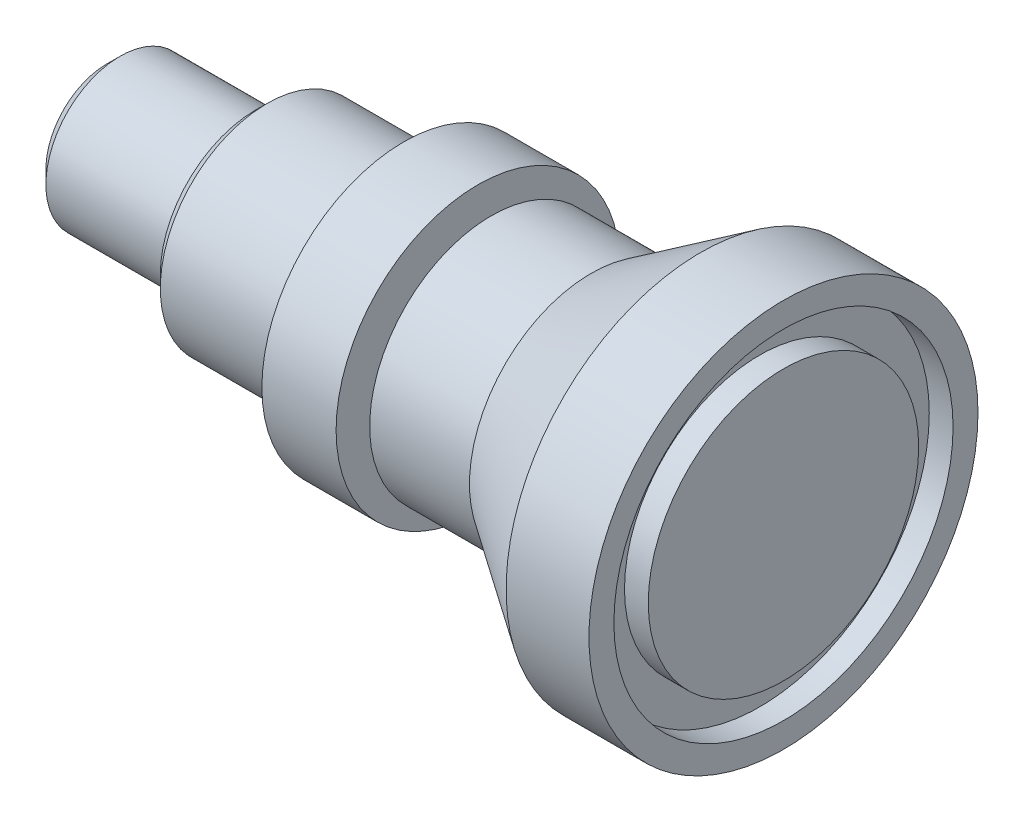
ISO-10303-21;
HEADER;
FILE_DESCRIPTION(('STEP AP214'),'2;1');
FILE_NAME('part.step','',(''),(''),'','','');
FILE_SCHEMA(('AUTOMOTIVE_DESIGN { 1 0 10303 214 1 1 1 1 }'));
ENDSEC;
DATA;
#1=APPLICATION_CONTEXT('core data for automotive mechanical design processes');
#2=APPLICATION_PROTOCOL_DEFINITION('international standard','automotive_design',2000,#1);
#3=PRODUCT_CONTEXT('',#1,'mechanical');
#4=PRODUCT('Part','Part','',(#3));
#5=PRODUCT_RELATED_PRODUCT_CATEGORY('part','',(#4));
#6=PRODUCT_DEFINITION_FORMATION('','',#4);
#7=PRODUCT_DEFINITION_CONTEXT('part definition',#1,'design');
#8=PRODUCT_DEFINITION('design','',#6,#7);
#9=PRODUCT_DEFINITION_SHAPE('','',#8);
#10=(LENGTH_UNIT() NAMED_UNIT(*) SI_UNIT(.MILLI.,.METRE.));
#11=(NAMED_UNIT(*) PLANE_ANGLE_UNIT() SI_UNIT($,.RADIAN.));
#12=(NAMED_UNIT(*) SI_UNIT($,.STERADIAN.) SOLID_ANGLE_UNIT());
#13=UNCERTAINTY_MEASURE_WITH_UNIT(LENGTH_MEASURE(1.E-05),#10,'distance_accuracy_value','');
#14=(GEOMETRIC_REPRESENTATION_CONTEXT(3) GLOBAL_UNCERTAINTY_ASSIGNED_CONTEXT((#13)) GLOBAL_UNIT_ASSIGNED_CONTEXT((#10,
#11,#12)) REPRESENTATION_CONTEXT('',''));
#15=CARTESIAN_POINT('',(0.,0.,0.));
#16=DIRECTION('',(0.,0.,1.));
#17=DIRECTION('',(1.,0.,0.));
#18=AXIS2_PLACEMENT_3D('',#15,#16,#17);
#19=CARTESIAN_POINT('',(0.,0.,0.));
#20=DIRECTION('',(-1.,0.,0.));
#21=DIRECTION('',(0.,0.,1.));
#22=AXIS2_PLACEMENT_3D('',#19,#20,#21);
#23=PLANE('',#22);
#24=CARTESIAN_POINT('',(0.,0.,0.));
#25=DIRECTION('',(1.,0.,0.));
#26=DIRECTION('',(0.,0.,-1.));
#27=AXIS2_PLACEMENT_3D('',#24,#25,#26);
#28=CIRCLE('',#27,2.60981675392669);
#29=CARTESIAN_POINT('',(0.,0.,-2.60981675392669));
#30=VERTEX_POINT('',#29);
#31=EDGE_CURVE('E10',#30,#30,#28,.T.);
#32=ORIENTED_EDGE('',*,*,#31,.F.);
#33=EDGE_LOOP('',(#32));
#34=FACE_BOUND('',#33,.T.);
#35=ADVANCED_FACE('F34',(#34),#23,.T.);
#36=CARTESIAN_POINT('',(0.565183246073291,0.,0.));
#37=DIRECTION('',(1.,0.,0.));
#38=DIRECTION('',(0.,0.,-1.));
#39=AXIS2_PLACEMENT_3D('',#36,#37,#38);
#40=CONICAL_SURFACE('',#39,3.175,0.785398163397462);
#41=ORIENTED_EDGE('',*,*,#31,.T.);
#42=EDGE_LOOP('',(#41));
#43=FACE_BOUND('',#42,.T.);
#44=CARTESIAN_POINT('',(0.565183246073291,0.,0.));
#45=DIRECTION('',(1.,0.,0.));
#46=DIRECTION('',(0.,0.,-1.));
#47=AXIS2_PLACEMENT_3D('',#44,#45,#46);
#48=CIRCLE('',#47,3.175);
#49=CARTESIAN_POINT('',(0.565183246073291,0.,-3.175));
#50=VERTEX_POINT('',#49);
#51=EDGE_CURVE('E40',#50,#50,#48,.T.);
#52=ORIENTED_EDGE('',*,*,#51,.F.);
#53=EDGE_LOOP('',(#52));
#54=FACE_BOUND('',#53,.T.);
#55=ADVANCED_FACE('F112',(#43,#54),#40,.T.);
#56=CARTESIAN_POINT('',(28.9459503845607,0.,0.));
#57=DIRECTION('',(1.,0.,0.));
#58=DIRECTION('',(0.,0.,-1.));
#59=AXIS2_PLACEMENT_3D('',#56,#57,#58);
#60=CYLINDRICAL_SURFACE('',#59,3.175);
#61=ORIENTED_EDGE('',*,*,#51,.T.);
#62=EDGE_LOOP('',(#61));
#63=FACE_BOUND('',#62,.T.);
#64=CARTESIAN_POINT('',(6.35,0.,0.));
#65=DIRECTION('',(1.,0.,0.));
#66=DIRECTION('',(0.,0.,-1.));
#67=AXIS2_PLACEMENT_3D('',#64,#65,#66);
#68=CIRCLE('',#67,3.175);
#69=CARTESIAN_POINT('',(6.35,0.,-3.175));
#70=VERTEX_POINT('',#69);
#71=EDGE_CURVE('E44',#70,#70,#68,.T.);
#72=ORIENTED_EDGE('',*,*,#71,.F.);
#73=EDGE_LOOP('',(#72));
#74=FACE_BOUND('',#73,.T.);
#75=ADVANCED_FACE('F117',(#63,#74),#60,.T.);
#76=CARTESIAN_POINT('',(6.35,3.175,0.));
#77=DIRECTION('',(-1.,0.,0.));
#78=DIRECTION('',(0.,0.,1.));
#79=AXIS2_PLACEMENT_3D('',#76,#77,#78);
#80=PLANE('',#79);
#81=ORIENTED_EDGE('',*,*,#71,.T.);
#82=EDGE_LOOP('',(#81));
#83=FACE_BOUND('',#82,.T.);
#84=CARTESIAN_POINT('',(6.35,0.,0.));
#85=DIRECTION('',(1.,0.,0.));
#86=DIRECTION('',(0.,0.,-1.));
#87=AXIS2_PLACEMENT_3D('',#84,#85,#86);
#88=CIRCLE('',#87,4.0658639837183);
#89=CARTESIAN_POINT('',(6.35,0.,-4.0658639837183));
#90=VERTEX_POINT('',#89);
#91=EDGE_CURVE('E48',#90,#90,#88,.T.);
#92=ORIENTED_EDGE('',*,*,#91,.F.);
#93=EDGE_LOOP('',(#92));
#94=FACE_BOUND('',#93,.T.);
#95=ADVANCED_FACE('F121',(#83,#94),#80,.T.);
#96=CARTESIAN_POINT('',(6.85613601628168,0.,0.));
#97=DIRECTION('',(1.,0.,0.));
#98=DIRECTION('',(0.,0.,-1.));
#99=AXIS2_PLACEMENT_3D('',#96,#97,#98);
#100=CONICAL_SURFACE('',#99,4.572,0.785398163397459);
#101=ORIENTED_EDGE('',*,*,#91,.T.);
#102=EDGE_LOOP('',(#101));
#103=FACE_BOUND('',#102,.T.);
#104=CARTESIAN_POINT('',(6.85613601628168,0.,0.));
#105=DIRECTION('',(1.,0.,0.));
#106=DIRECTION('',(0.,0.,-1.));
#107=AXIS2_PLACEMENT_3D('',#104,#105,#106);
#108=CIRCLE('',#107,4.572);
#109=CARTESIAN_POINT('',(6.85613601628168,0.,-4.572));
#110=VERTEX_POINT('',#109);
#111=EDGE_CURVE('E53',#110,#110,#108,.T.);
#112=ORIENTED_EDGE('',*,*,#111,.F.);
#113=EDGE_LOOP('',(#112));
#114=FACE_BOUND('',#113,.T.);
#115=ADVANCED_FACE('F127',(#103,#114),#100,.T.);
#116=CARTESIAN_POINT('',(28.9459503845607,0.,0.));
#117=DIRECTION('',(1.,0.,0.));
#118=DIRECTION('',(0.,0.,-1.));
#119=AXIS2_PLACEMENT_3D('',#116,#117,#118);
#120=CYLINDRICAL_SURFACE('',#119,4.572);
#121=ORIENTED_EDGE('',*,*,#111,.T.);
#122=EDGE_LOOP('',(#121));
#123=FACE_BOUND('',#122,.T.);
#124=CARTESIAN_POINT('',(12.7,0.,0.));
#125=DIRECTION('',(1.,0.,0.));
#126=DIRECTION('',(0.,0.,-1.));
#127=AXIS2_PLACEMENT_3D('',#124,#125,#126);
#128=CIRCLE('',#127,4.572);
#129=CARTESIAN_POINT('',(12.7,0.,-4.572));
#130=VERTEX_POINT('',#129);
#131=EDGE_CURVE('E56',#130,#130,#128,.T.);
#132=ORIENTED_EDGE('',*,*,#131,.F.);
#133=EDGE_LOOP('',(#132));
#134=FACE_BOUND('',#133,.T.);
#135=ADVANCED_FACE('F131',(#123,#134),#120,.T.);
#136=CARTESIAN_POINT('',(12.7,4.572,0.));
#137=DIRECTION('',(-1.,0.,0.));
#138=DIRECTION('',(0.,0.,1.));
#139=AXIS2_PLACEMENT_3D('',#136,#137,#138);
#140=PLANE('',#139);
#141=ORIENTED_EDGE('',*,*,#131,.T.);
#142=EDGE_LOOP('',(#141));
#143=FACE_BOUND('',#142,.T.);
#144=CARTESIAN_POINT('',(12.7,0.,0.));
#145=DIRECTION('',(1.,0.,0.));
#146=DIRECTION('',(0.,0.,-1.));
#147=AXIS2_PLACEMENT_3D('',#144,#145,#146);
#148=CIRCLE('',#147,6.06906472114014);
#149=CARTESIAN_POINT('',(12.7,0.,-6.06906472114014));
#150=VERTEX_POINT('',#149);
#151=EDGE_CURVE('E59',#150,#150,#148,.T.);
#152=ORIENTED_EDGE('',*,*,#151,.F.);
#153=EDGE_LOOP('',(#152));
#154=FACE_BOUND('',#153,.T.);
#155=ADVANCED_FACE('F135',(#143,#154),#140,.T.);
#156=CARTESIAN_POINT('',(28.9459503845607,0.,0.));
#157=DIRECTION('',(1.,0.,0.));
#158=DIRECTION('',(0.,0.,-1.));
#159=AXIS2_PLACEMENT_3D('',#156,#157,#158);
#160=CYLINDRICAL_SURFACE('',#159,6.06906472114014);
#161=ORIENTED_EDGE('',*,*,#151,.T.);
#162=EDGE_LOOP('',(#161));
#163=FACE_BOUND('',#162,.T.);
#164=CARTESIAN_POINT('',(15.875,0.,0.));
#165=DIRECTION('',(1.,0.,0.));
#166=DIRECTION('',(0.,0.,-1.));
#167=AXIS2_PLACEMENT_3D('',#164,#165,#166);
#168=CIRCLE('',#167,6.06906472114013);
#169=CARTESIAN_POINT('',(15.875,0.,-6.06906472114013));
#170=VERTEX_POINT('',#169);
#171=EDGE_CURVE('E62',#170,#170,#168,.T.);
#172=ORIENTED_EDGE('',*,*,#171,.F.);
#173=EDGE_LOOP('',(#172));
#174=FACE_BOUND('',#173,.T.);
#175=ADVANCED_FACE('F139',(#163,#174),#160,.T.);
#176=CARTESIAN_POINT('',(15.875,6.06906472114013,0.));
#177=DIRECTION('',(1.,0.,0.));
#178=DIRECTION('',(0.,0.,-1.));
#179=AXIS2_PLACEMENT_3D('',#176,#177,#178);
#180=PLANE('',#179);
#181=ORIENTED_EDGE('',*,*,#171,.T.);
#182=EDGE_LOOP('',(#181));
#183=FACE_BOUND('',#182,.T.);
#184=CARTESIAN_POINT('',(15.875,0.,0.));
#185=DIRECTION('',(1.,0.,0.));
#186=DIRECTION('',(0.,0.,-1.));
#187=AXIS2_PLACEMENT_3D('',#184,#185,#186);
#188=CIRCLE('',#187,3.175);
#189=CARTESIAN_POINT('',(15.875,0.,-3.175));
#190=VERTEX_POINT('',#189);
#191=EDGE_CURVE('E65',#190,#190,#188,.T.);
#192=ORIENTED_EDGE('',*,*,#191,.F.);
#193=EDGE_LOOP('',(#192));
#194=FACE_BOUND('',#193,.T.);
#195=ADVANCED_FACE('F143',(#183,#194),#180,.T.);
#196=CARTESIAN_POINT('',(28.9459503845607,0.,0.));
#197=DIRECTION('',(1.,0.,0.));
#198=DIRECTION('',(0.,0.,-1.));
#199=AXIS2_PLACEMENT_3D('',#196,#197,#198);
#200=CYLINDRICAL_SURFACE('',#199,3.175);
#201=ORIENTED_EDGE('',*,*,#191,.T.);
#202=EDGE_LOOP('',(#201));
#203=FACE_BOUND('',#202,.T.);
#204=CARTESIAN_POINT('',(16.4475530868086,0.,0.));
#205=DIRECTION('',(1.,0.,0.));
#206=DIRECTION('',(0.,0.,-1.));
#207=AXIS2_PLACEMENT_3D('',#204,#205,#206);
#208=CIRCLE('',#207,3.175);
#209=CARTESIAN_POINT('',(16.4475530868086,0.,-3.175));
#210=VERTEX_POINT('',#209);
#211=EDGE_CURVE('E68',#210,#210,#208,.T.);
#212=ORIENTED_EDGE('',*,*,#211,.F.);
#213=EDGE_LOOP('',(#212));
#214=FACE_BOUND('',#213,.T.);
#215=ADVANCED_FACE('F147',(#203,#214),#200,.T.);
#216=CARTESIAN_POINT('',(16.4475530868086,3.175,0.));
#217=DIRECTION('',(-1.,0.,0.));
#218=DIRECTION('',(0.,0.,1.));
#219=AXIS2_PLACEMENT_3D('',#216,#217,#218);
#220=PLANE('',#219);
#221=ORIENTED_EDGE('',*,*,#211,.T.);
#222=EDGE_LOOP('',(#221));
#223=FACE_BOUND('',#222,.T.);
#224=CARTESIAN_POINT('',(16.4475530868086,0.,0.));
#225=DIRECTION('',(1.,0.,0.));
#226=DIRECTION('',(0.,0.,-1.));
#227=AXIS2_PLACEMENT_3D('',#224,#225,#226);
#228=CIRCLE('',#227,5.20488643043044);
#229=CARTESIAN_POINT('',(16.4475530868086,0.,-5.20488643043044));
#230=VERTEX_POINT('',#229);
#231=EDGE_CURVE('E71',#230,#230,#228,.T.);
#232=ORIENTED_EDGE('',*,*,#231,.F.);
#233=EDGE_LOOP('',(#232));
#234=FACE_BOUND('',#233,.T.);
#235=ADVANCED_FACE('F151',(#223,#234),#220,.T.);
#236=CARTESIAN_POINT('',(28.9459503845607,0.,0.));
#237=DIRECTION('',(1.,0.,0.));
#238=DIRECTION('',(0.,0.,-1.));
#239=AXIS2_PLACEMENT_3D('',#236,#237,#238);
#240=CYLINDRICAL_SURFACE('',#239,5.20488643043044);
#241=ORIENTED_EDGE('',*,*,#231,.T.);
#242=EDGE_LOOP('',(#241));
#243=FACE_BOUND('',#242,.T.);
#244=CARTESIAN_POINT('',(20.7157148315544,0.,0.));
#245=DIRECTION('',(1.,0.,0.));
#246=DIRECTION('',(0.,0.,-1.));
#247=AXIS2_PLACEMENT_3D('',#244,#245,#246);
#248=CIRCLE('',#247,5.20488643043044);
#249=CARTESIAN_POINT('',(20.7157148315544,0.,-5.20488643043044));
#250=VERTEX_POINT('',#249);
#251=EDGE_CURVE('E74',#250,#250,#248,.T.);
#252=ORIENTED_EDGE('',*,*,#251,.F.);
#253=EDGE_LOOP('',(#252));
#254=FACE_BOUND('',#253,.T.);
#255=ADVANCED_FACE('F155',(#243,#254),#240,.T.);
#256=CARTESIAN_POINT('',(25.4016977435136,0.,0.));
#257=DIRECTION('',(1.,0.,0.));
#258=DIRECTION('',(0.,0.,-1.));
#259=AXIS2_PLACEMENT_3D('',#256,#257,#258);
#260=CONICAL_SURFACE('',#259,8.32195174189064,0.586979057270359);
#261=ORIENTED_EDGE('',*,*,#251,.T.);
#262=EDGE_LOOP('',(#261));
#263=FACE_BOUND('',#262,.T.);
#264=CARTESIAN_POINT('',(25.4016977435136,0.,0.));
#265=DIRECTION('',(1.,0.,0.));
#266=DIRECTION('',(0.,0.,-1.));
#267=AXIS2_PLACEMENT_3D('',#264,#265,#266);
#268=CIRCLE('',#267,8.32195174189064);
#269=CARTESIAN_POINT('',(25.4016977435136,0.,-8.32195174189064));
#270=VERTEX_POINT('',#269);
#271=EDGE_CURVE('E77',#270,#270,#268,.T.);
#272=ORIENTED_EDGE('',*,*,#271,.F.);
#273=EDGE_LOOP('',(#272));
#274=FACE_BOUND('',#273,.T.);
#275=ADVANCED_FACE('F159',(#263,#274),#260,.T.);
#276=CARTESIAN_POINT('',(28.9459503845607,0.,0.));
#277=DIRECTION('',(1.,0.,0.));
#278=DIRECTION('',(0.,0.,-1.));
#279=AXIS2_PLACEMENT_3D('',#276,#277,#278);
#280=CYLINDRICAL_SURFACE('',#279,8.32195174189064);
#281=ORIENTED_EDGE('',*,*,#271,.T.);
#282=EDGE_LOOP('',(#281));
#283=FACE_BOUND('',#282,.T.);
#284=CARTESIAN_POINT('',(28.9459503845607,0.,0.));
#285=DIRECTION('',(1.,0.,0.));
#286=DIRECTION('',(0.,0.,-1.));
#287=AXIS2_PLACEMENT_3D('',#284,#285,#286);
#288=CIRCLE('',#287,8.32195174189064);
#289=CARTESIAN_POINT('',(28.9459503845607,0.,-8.32195174189064));
#290=VERTEX_POINT('',#289);
#291=EDGE_CURVE('E80',#290,#290,#288,.T.);
#292=ORIENTED_EDGE('',*,*,#291,.F.);
#293=EDGE_LOOP('',(#292));
#294=FACE_BOUND('',#293,.T.);
#295=ADVANCED_FACE('F163',(#283,#294),#280,.T.);
#296=CARTESIAN_POINT('',(28.9459503845607,8.32195174189064,0.));
#297=DIRECTION('',(1.,0.,0.));
#298=DIRECTION('',(0.,0.,-1.));
#299=AXIS2_PLACEMENT_3D('',#296,#297,#298);
#300=PLANE('',#299);
#301=ORIENTED_EDGE('',*,*,#291,.T.);
#302=EDGE_LOOP('',(#301));
#303=FACE_BOUND('',#302,.T.);
#304=CARTESIAN_POINT('',(28.9459503845607,0.,0.));
#305=DIRECTION('',(1.,0.,0.));
#306=DIRECTION('',(0.,0.,-1.));
#307=AXIS2_PLACEMENT_3D('',#304,#305,#306);
#308=CIRCLE('',#307,7.25527662411353);
#309=CARTESIAN_POINT('',(28.9459503845607,0.,-7.25527662411353));
#310=VERTEX_POINT('',#309);
#311=EDGE_CURVE('E83',#310,#310,#308,.T.);
#312=ORIENTED_EDGE('',*,*,#311,.F.);
#313=EDGE_LOOP('',(#312));
#314=FACE_BOUND('',#313,.T.);
#315=ADVANCED_FACE('F167',(#303,#314),#300,.T.);
#316=CARTESIAN_POINT('',(28.9459503845607,0.,0.));
#317=DIRECTION('',(1.,0.,0.));
#318=DIRECTION('',(0.,0.,-1.));
#319=AXIS2_PLACEMENT_3D('',#316,#317,#318);
#320=CYLINDRICAL_SURFACE('',#319,7.25527662411353);
#321=ORIENTED_EDGE('',*,*,#311,.T.);
#322=EDGE_LOOP('',(#321));
#323=FACE_BOUND('',#322,.T.);
#324=CARTESIAN_POINT('',(27.9283108867266,0.,0.));
#325=DIRECTION('',(1.,0.,0.));
#326=DIRECTION('',(0.,0.,-1.));
#327=AXIS2_PLACEMENT_3D('',#324,#325,#326);
#328=CIRCLE('',#327,7.25527662411353);
#329=CARTESIAN_POINT('',(27.9283108867266,0.,-7.25527662411353));
#330=VERTEX_POINT('',#329);
#331=EDGE_CURVE('E86',#330,#330,#328,.T.);
#332=ORIENTED_EDGE('',*,*,#331,.F.);
#333=EDGE_LOOP('',(#332));
#334=FACE_BOUND('',#333,.T.);
#335=ADVANCED_FACE('F108',(#323,#334),#320,.F.);
#336=CARTESIAN_POINT('',(27.9283108867266,7.25527662411353,0.));
#337=DIRECTION('',(1.,0.,0.));
#338=DIRECTION('',(0.,0.,-1.));
#339=AXIS2_PLACEMENT_3D('',#336,#337,#338);
#340=PLANE('',#339);
#341=ORIENTED_EDGE('',*,*,#331,.T.);
#342=EDGE_LOOP('',(#341));
#343=FACE_BOUND('',#342,.T.);
#344=CARTESIAN_POINT('',(27.9283108867266,0.,0.));
#345=DIRECTION('',(1.,0.,0.));
#346=DIRECTION('',(0.,0.,-1.));
#347=AXIS2_PLACEMENT_3D('',#344,#345,#346);
#348=CIRCLE('',#347,5.7848167539267);
#349=CARTESIAN_POINT('',(27.9283108867266,0.,-5.7848167539267));
#350=VERTEX_POINT('',#349);
#351=EDGE_CURVE('E89',#350,#350,#348,.T.);
#352=ORIENTED_EDGE('',*,*,#351,.F.);
#353=EDGE_LOOP('',(#352));
#354=FACE_BOUND('',#353,.T.);
#355=ADVANCED_FACE('F100',(#343,#354),#340,.T.);
#356=CARTESIAN_POINT('',(28.9459503845607,0.,0.));
#357=DIRECTION('',(1.,0.,0.));
#358=DIRECTION('',(0.,0.,-1.));
#359=AXIS2_PLACEMENT_3D('',#356,#357,#358);
#360=CYLINDRICAL_SURFACE('',#359,5.7848167539267);
#361=ORIENTED_EDGE('',*,*,#351,.T.);
#362=EDGE_LOOP('',(#361));
#363=FACE_BOUND('',#362,.T.);
#364=CARTESIAN_POINT('',(28.9459503845607,0.,0.));
#365=DIRECTION('',(1.,0.,0.));
#366=DIRECTION('',(0.,0.,-1.));
#367=AXIS2_PLACEMENT_3D('',#364,#365,#366);
#368=CIRCLE('',#367,5.7848167539267);
#369=CARTESIAN_POINT('',(28.9459503845607,0.,-5.7848167539267));
#370=VERTEX_POINT('',#369);
#371=EDGE_CURVE('E92',#370,#370,#368,.T.);
#372=ORIENTED_EDGE('',*,*,#371,.F.);
#373=EDGE_LOOP('',(#372));
#374=FACE_BOUND('',#373,.T.);
#375=ADVANCED_FACE('F98',(#363,#374),#360,.T.);
#376=CARTESIAN_POINT('',(28.9459503845607,5.7848167539267,0.));
#377=DIRECTION('',(1.,0.,0.));
#378=DIRECTION('',(0.,0.,-1.));
#379=AXIS2_PLACEMENT_3D('',#376,#377,#378);
#380=PLANE('',#379);
#381=ORIENTED_EDGE('',*,*,#371,.T.);
#382=EDGE_LOOP('',(#381));
#383=FACE_BOUND('',#382,.T.);
#384=ADVANCED_FACE('F96',(#383),#380,.T.);
#385=CLOSED_SHELL('',(#35,#55,#75,#95,#115,#135,#155,#175,#195,#215,#235,#255,#275,#295,#315,
#335,#355,#375,#384));
#386=MANIFOLD_SOLID_BREP('B2',#385);
#387=ADVANCED_BREP_SHAPE_REPRESENTATION('',(#18,#386),#14);
#388=SHAPE_DEFINITION_REPRESENTATION(#9,#387);
ENDSEC;
END-ISO-10303-21;
